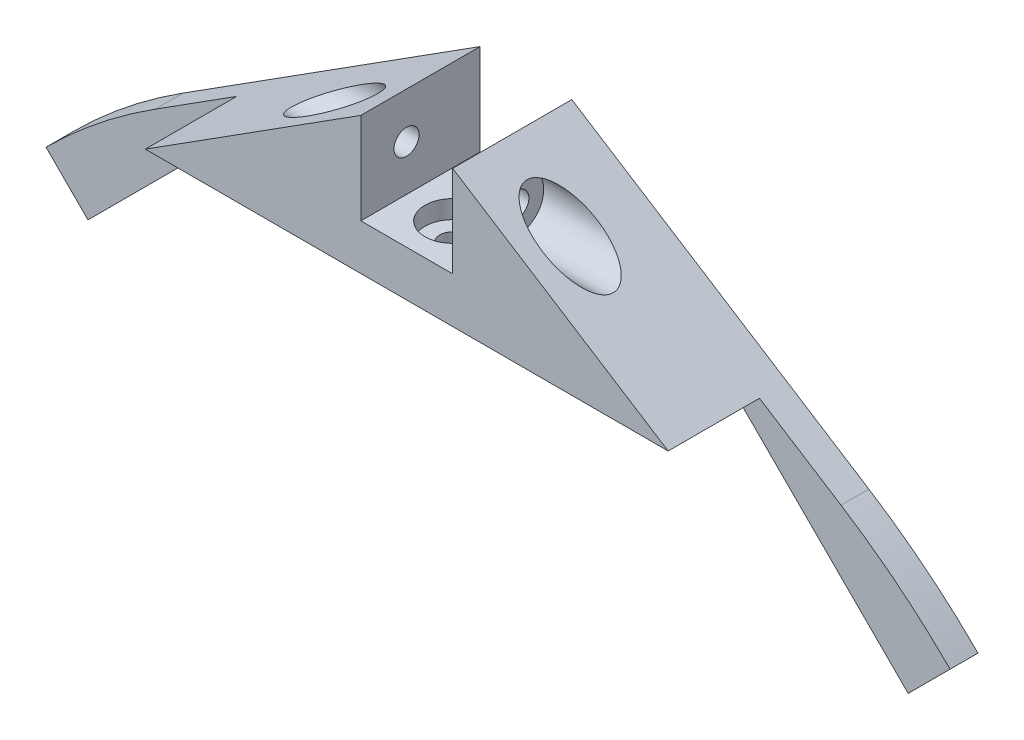
ISO-10303-21;
HEADER;
FILE_DESCRIPTION(('STEP AP214'),'2;1');
FILE_NAME('part.step','',(''),(''),'','','');
FILE_SCHEMA(('AUTOMOTIVE_DESIGN { 1 0 10303 214 1 1 1 1 }'));
ENDSEC;
DATA;
#1=APPLICATION_CONTEXT('core data for automotive mechanical design processes');
#2=APPLICATION_PROTOCOL_DEFINITION('international standard','automotive_design',2000,#1);
#3=PRODUCT_CONTEXT('',#1,'mechanical');
#4=PRODUCT('Part','Part','',(#3));
#5=PRODUCT_RELATED_PRODUCT_CATEGORY('part','',(#4));
#6=PRODUCT_DEFINITION_FORMATION('','',#4);
#7=PRODUCT_DEFINITION_CONTEXT('part definition',#1,'design');
#8=PRODUCT_DEFINITION('design','',#6,#7);
#9=PRODUCT_DEFINITION_SHAPE('','',#8);
#10=(LENGTH_UNIT() NAMED_UNIT(*) SI_UNIT(.MILLI.,.METRE.));
#11=(NAMED_UNIT(*) PLANE_ANGLE_UNIT() SI_UNIT($,.RADIAN.));
#12=(NAMED_UNIT(*) SI_UNIT($,.STERADIAN.) SOLID_ANGLE_UNIT());
#13=UNCERTAINTY_MEASURE_WITH_UNIT(LENGTH_MEASURE(1.E-05),#10,'distance_accuracy_value','');
#14=(GEOMETRIC_REPRESENTATION_CONTEXT(3) GLOBAL_UNCERTAINTY_ASSIGNED_CONTEXT((#13)) GLOBAL_UNIT_ASSIGNED_CONTEXT((#10,
#11,#12)) REPRESENTATION_CONTEXT('',''));
#15=CARTESIAN_POINT('',(0.,0.,0.));
#16=DIRECTION('',(0.,0.,1.));
#17=DIRECTION('',(1.,0.,0.));
#18=AXIS2_PLACEMENT_3D('',#15,#16,#17);
#19=CARTESIAN_POINT('',(-98.9949493661174,149.5,10.));
#20=DIRECTION('',(1.,0.,0.));
#21=DIRECTION('',(0.,0.,-1.));
#22=AXIS2_PLACEMENT_3D('',#19,#20,#21);
#23=CYLINDRICAL_SURFACE('',#22,2.75);
#24=CARTESIAN_POINT('',(10.0499999999994,149.5,10.));
#25=DIRECTION('',(1.,0.,0.));
#26=DIRECTION('',(0.,1.,0.));
#27=AXIS2_PLACEMENT_3D('',#24,#25,#26);
#28=CIRCLE('',#27,2.75);
#29=CARTESIAN_POINT('',(10.0499999999994,152.25,10.));
#30=VERTEX_POINT('',#29);
#31=EDGE_CURVE('E262',#30,#30,#28,.T.);
#32=ORIENTED_EDGE('',*,*,#31,.F.);
#33=EDGE_LOOP('',(#32));
#34=FACE_BOUND('',#33,.T.);
#35=CARTESIAN_POINT('',(14.,149.5,10.));
#36=DIRECTION('',(1.,0.,0.));
#37=DIRECTION('',(0.,0.,-1.));
#38=AXIS2_PLACEMENT_3D('',#35,#36,#37);
#39=CIRCLE('',#38,2.75);
#40=CARTESIAN_POINT('',(14.,149.5,7.25));
#41=VERTEX_POINT('',#40);
#42=EDGE_CURVE('E256',#41,#41,#39,.F.);
#43=ORIENTED_EDGE('',*,*,#42,.F.);
#44=EDGE_LOOP('',(#43));
#45=FACE_BOUND('',#44,.T.);
#46=ADVANCED_FACE('F36',(#34,#45),#23,.F.);
#47=CARTESIAN_POINT('',(3.34600629187397E-13,119.5,10.));
#48=DIRECTION('',(0.,1.,0.));
#49=DIRECTION('',(-1.,0.,0.));
#50=AXIS2_PLACEMENT_3D('',#47,#48,#49);
#51=CYLINDRICAL_SURFACE('',#50,2.75);
#52=CARTESIAN_POINT('',(3.62218117362153E-13,129.5,10.));
#53=DIRECTION('',(0.,-1.,0.));
#54=DIRECTION('',(0.,0.,-1.));
#55=AXIS2_PLACEMENT_3D('',#52,#53,#54);
#56=CIRCLE('',#55,2.75);
#57=CARTESIAN_POINT('',(3.62218117362153E-13,129.5,7.25));
#58=VERTEX_POINT('',#57);
#59=EDGE_CURVE('E161',#58,#58,#56,.T.);
#60=ORIENTED_EDGE('',*,*,#59,.T.);
#61=EDGE_LOOP('',(#60));
#62=FACE_BOUND('',#61,.T.);
#63=CARTESIAN_POINT('',(3.78788610267007E-13,135.5,10.));
#64=DIRECTION('',(0.,1.,0.));
#65=DIRECTION('',(-1.,0.,0.));
#66=AXIS2_PLACEMENT_3D('',#63,#64,#65);
#67=CIRCLE('',#66,2.75);
#68=CARTESIAN_POINT('',(-2.74999999999962,135.5,10.));
#69=VERTEX_POINT('',#68);
#70=EDGE_CURVE('E166',#69,#69,#67,.F.);
#71=ORIENTED_EDGE('',*,*,#70,.F.);
#72=EDGE_LOOP('',(#71));
#73=FACE_BOUND('',#72,.T.);
#74=ADVANCED_FACE('F302',(#62,#73),#51,.F.);
#75=CARTESIAN_POINT('',(1.23866037892397E-11,1.24063554245807E-11,0.));
#76=DIRECTION('',(0.,0.,1.));
#77=DIRECTION('',(1.,0.,0.));
#78=AXIS2_PLACEMENT_3D('',#75,#76,#77);
#79=PLANE('',#78);
#80=DIRECTION('',(-0.843942591214155,0.536433502621469,0.));
#81=VECTOR('',#80,1.);
#82=CARTESIAN_POINT('',(10.0499999999994,159.5,0.));
#83=LINE('',#82,#81);
#84=CARTESIAN_POINT('',(75.1006903669907,118.151962769992,0.));
#85=VERTEX_POINT('',#84);
#86=CARTESIAN_POINT('',(57.2474207664098,129.5,0.));
#87=VERTEX_POINT('',#86);
#88=EDGE_CURVE('E61',#85,#87,#83,.T.);
#89=ORIENTED_EDGE('',*,*,#88,.T.);
#90=DIRECTION('',(1.,0.,0.));
#91=VECTOR('',#90,1.);
#92=CARTESIAN_POINT('',(50.1051224213822,129.5,0.));
#93=LINE('',#92,#91);
#94=CARTESIAN_POINT('',(50.105122421383,129.5,0.));
#95=VERTEX_POINT('',#94);
#96=EDGE_CURVE('E160',#95,#87,#93,.T.);
#97=ORIENTED_EDGE('',*,*,#96,.F.);
#98=DIRECTION('',(0.707106781186547,-0.707106781186548,0.));
#99=VECTOR('',#98,1.);
#100=CARTESIAN_POINT('',(50.105122421383,129.5,0.));
#101=LINE('',#100,#99);
#102=CARTESIAN_POINT('',(89.8025612106913,89.8025612106917,0.));
#103=VERTEX_POINT('',#102);
#104=EDGE_CURVE('E213',#95,#103,#101,.T.);
#105=ORIENTED_EDGE('',*,*,#104,.T.);
#106=DIRECTION('',(0.707106781186548,0.707106781186548,0.));
#107=VECTOR('',#106,1.);
#108=CARTESIAN_POINT('',(89.8025612106913,89.8025612106917,0.));
#109=LINE('',#108,#107);
#110=CARTESIAN_POINT('',(98.9949493661289,98.9949493661292,0.));
#111=VERTEX_POINT('',#110);
#112=EDGE_CURVE('E208',#103,#111,#109,.T.);
#113=ORIENTED_EDGE('',*,*,#112,.T.);
#114=CARTESIAN_POINT('',(1.23866037892397E-11,1.24063554245807E-11,0.));
#115=DIRECTION('',(0.,0.,1.));
#116=DIRECTION('',(1.,0.,0.));
#117=AXIS2_PLACEMENT_3D('',#114,#115,#116);
#118=CIRCLE('',#117,140.);
#119=EDGE_CURVE('E233',#111,#85,#118,.T.);
#120=ORIENTED_EDGE('',*,*,#119,.T.);
#121=EDGE_LOOP('',(#89,#97,#105,#113,#120));
#122=FACE_BOUND('',#121,.T.);
#123=ADVANCED_FACE('F309',(#122),#79,.T.);
#124=DIRECTION('',(0.707106781186525,0.70710678118657,0.));
#125=VECTOR('',#124,1.);
#126=CARTESIAN_POINT('',(-89.8025612106907,89.8025612106898,0.));
#127=LINE('',#126,#125);
#128=CARTESIAN_POINT('',(-89.8025612106907,89.8025612106898,0.));
#129=VERTEX_POINT('',#128);
#130=CARTESIAN_POINT('',(-50.1051224213829,129.5,0.));
#131=VERTEX_POINT('',#130);
#132=EDGE_CURVE('E238',#129,#131,#127,.T.);
#133=ORIENTED_EDGE('',*,*,#132,.T.);
#134=DIRECTION('',(1.,0.,0.));
#135=VECTOR('',#134,1.);
#136=CARTESIAN_POINT('',(-50.1051224213829,129.5,0.));
#137=LINE('',#136,#135);
#138=CARTESIAN_POINT('',(-57.2474207664105,129.5,0.));
#139=VERTEX_POINT('',#138);
#140=EDGE_CURVE('E175',#139,#131,#137,.T.);
#141=ORIENTED_EDGE('',*,*,#140,.F.);
#142=DIRECTION('',(-0.843942591214158,-0.536433502621465,0.));
#143=VECTOR('',#142,1.);
#144=CARTESIAN_POINT('',(-10.05,159.5,0.));
#145=LINE('',#144,#143);
#146=CARTESIAN_POINT('',(-75.1006903669927,118.151962769995,0.));
#147=VERTEX_POINT('',#146);
#148=EDGE_CURVE('E184',#139,#147,#145,.T.);
#149=ORIENTED_EDGE('',*,*,#148,.T.);
#150=CARTESIAN_POINT('',(-98.9949493661174,98.994949366116,0.));
#151=VERTEX_POINT('',#150);
#152=EDGE_CURVE('E232',#147,#151,#118,.T.);
#153=ORIENTED_EDGE('',*,*,#152,.T.);
#154=DIRECTION('',(0.70710678118657,-0.707106781186525,0.));
#155=VECTOR('',#154,1.);
#156=CARTESIAN_POINT('',(-89.8025612106907,89.8025612106898,0.));
#157=LINE('',#156,#155);
#158=EDGE_CURVE('E235',#151,#129,#157,.T.);
#159=ORIENTED_EDGE('',*,*,#158,.T.);
#160=EDGE_LOOP('',(#133,#141,#149,#153,#159));
#161=FACE_BOUND('',#160,.T.);
#162=ADVANCED_FACE('F373',(#161),#79,.T.);
#163=CARTESIAN_POINT('',(1.23866037892397E-11,1.24063554245807E-11,-6.1));
#164=DIRECTION('',(0.,0.,1.));
#165=DIRECTION('',(1.,0.,0.));
#166=AXIS2_PLACEMENT_3D('',#163,#164,#165);
#167=CYLINDRICAL_SURFACE('',#166,140.);
#168=ORIENTED_EDGE('',*,*,#152,.F.);
#169=DIRECTION('',(0.,0.,1.));
#170=VECTOR('',#169,1.);
#171=CARTESIAN_POINT('',(-75.1006903669927,118.151962769995,-6.1));
#172=LINE('',#171,#170);
#173=CARTESIAN_POINT('',(-75.1006903669927,118.151962769995,-6.1));
#174=VERTEX_POINT('',#173);
#175=EDGE_CURVE('E148',#174,#147,#172,.T.);
#176=ORIENTED_EDGE('',*,*,#175,.F.);
#177=CARTESIAN_POINT('',(1.23866037892397E-11,1.24063554245807E-11,-6.1));
#178=DIRECTION('',(0.,0.,1.));
#179=DIRECTION('',(1.,0.,0.));
#180=AXIS2_PLACEMENT_3D('',#177,#178,#179);
#181=CIRCLE('',#180,140.);
#182=CARTESIAN_POINT('',(-98.9949493661174,98.994949366116,-6.1));
#183=VERTEX_POINT('',#182);
#184=EDGE_CURVE('E212',#174,#183,#181,.T.);
#185=ORIENTED_EDGE('',*,*,#184,.T.);
#186=DIRECTION('',(0.,0.,1.));
#187=VECTOR('',#186,1.);
#188=CARTESIAN_POINT('',(-98.9949493661174,98.994949366116,-6.1));
#189=LINE('',#188,#187);
#190=EDGE_CURVE('E249',#183,#151,#189,.T.);
#191=ORIENTED_EDGE('',*,*,#190,.T.);
#192=EDGE_LOOP('',(#168,#176,#185,#191));
#193=FACE_BOUND('',#192,.T.);
#194=ADVANCED_FACE('F369',(#193),#167,.T.);
#195=CARTESIAN_POINT('',(89.8025612106913,89.8025612106917,-6.1));
#196=DIRECTION('',(0.707106781186548,-0.707106781186548,0.));
#197=DIRECTION('',(0.707106781186548,0.707106781186548,0.));
#198=AXIS2_PLACEMENT_3D('',#195,#196,#197);
#199=PLANE('',#198);
#200=ORIENTED_EDGE('',*,*,#112,.F.);
#201=DIRECTION('',(0.,0.,1.));
#202=VECTOR('',#201,1.);
#203=CARTESIAN_POINT('',(89.8025612106913,89.8025612106917,-6.1));
#204=LINE('',#203,#202);
#205=CARTESIAN_POINT('',(89.8025612106913,89.8025612106917,-6.1));
#206=VERTEX_POINT('',#205);
#207=EDGE_CURVE('E11',#206,#103,#204,.T.);
#208=ORIENTED_EDGE('',*,*,#207,.F.);
#209=DIRECTION('',(0.707106781186548,0.707106781186548,0.));
#210=VECTOR('',#209,1.);
#211=CARTESIAN_POINT('',(89.8025612106913,89.8025612106917,-6.1));
#212=LINE('',#211,#210);
#213=CARTESIAN_POINT('',(98.9949493661289,98.9949493661292,-6.1));
#214=VERTEX_POINT('',#213);
#215=EDGE_CURVE('E209',#206,#214,#212,.T.);
#216=ORIENTED_EDGE('',*,*,#215,.T.);
#217=DIRECTION('',(0.,0.,1.));
#218=VECTOR('',#217,1.);
#219=CARTESIAN_POINT('',(98.9949493661289,98.9949493661292,-6.1));
#220=LINE('',#219,#218);
#221=EDGE_CURVE('E229',#214,#111,#220,.T.);
#222=ORIENTED_EDGE('',*,*,#221,.T.);
#223=EDGE_LOOP('',(#200,#208,#216,#222));
#224=FACE_BOUND('',#223,.T.);
#225=ADVANCED_FACE('F38',(#224),#199,.T.);
#226=CARTESIAN_POINT('',(50.105122421383,129.5,-6.1));
#227=DIRECTION('',(-0.707106781186548,-0.707106781186547,0.));
#228=DIRECTION('',(0.707106781186547,-0.707106781186548,0.));
#229=AXIS2_PLACEMENT_3D('',#226,#227,#228);
#230=PLANE('',#229);
#231=ORIENTED_EDGE('',*,*,#104,.F.);
#232=DIRECTION('',(0.,0.,1.));
#233=VECTOR('',#232,1.);
#234=CARTESIAN_POINT('',(50.105122421383,129.5,-6.1));
#235=LINE('',#234,#233);
#236=CARTESIAN_POINT('',(50.105122421383,129.5,-6.1));
#237=VERTEX_POINT('',#236);
#238=EDGE_CURVE('E45',#237,#95,#235,.T.);
#239=ORIENTED_EDGE('',*,*,#238,.F.);
#240=DIRECTION('',(0.707106781186547,-0.707106781186548,0.));
#241=VECTOR('',#240,1.);
#242=CARTESIAN_POINT('',(50.105122421383,129.5,-6.1));
#243=LINE('',#242,#241);
#244=EDGE_CURVE('E226',#237,#206,#243,.T.);
#245=ORIENTED_EDGE('',*,*,#244,.T.);
#246=ORIENTED_EDGE('',*,*,#207,.T.);
#247=EDGE_LOOP('',(#231,#239,#245,#246));
#248=FACE_BOUND('',#247,.T.);
#249=ADVANCED_FACE('F353',(#248),#230,.T.);
#250=CARTESIAN_POINT('',(50.105122421383,129.5,-6.1));
#251=DIRECTION('',(0.,-1.,0.));
#252=DIRECTION('',(0.,0.,-1.));
#253=AXIS2_PLACEMENT_3D('',#250,#251,#252);
#254=PLANE('',#253);
#255=ORIENTED_EDGE('',*,*,#59,.F.);
#256=EDGE_LOOP('',(#255));
#257=FACE_BOUND('',#256,.T.);
#258=DIRECTION('',(1.,0.,0.));
#259=VECTOR('',#258,1.);
#260=CARTESIAN_POINT('',(-50.1051224213829,129.5,20.));
#261=LINE('',#260,#259);
#262=CARTESIAN_POINT('',(-57.2474207664105,129.5,20.));
#263=VERTEX_POINT('',#262);
#264=CARTESIAN_POINT('',(57.2474207664098,129.5,20.));
#265=VERTEX_POINT('',#264);
#266=EDGE_CURVE('E198',#263,#265,#261,.T.);
#267=ORIENTED_EDGE('',*,*,#266,.F.);
#268=DIRECTION('',(0.,0.,-1.));
#269=VECTOR('',#268,1.);
#270=CARTESIAN_POINT('',(-57.2474207664105,129.5,20.));
#271=LINE('',#270,#269);
#272=EDGE_CURVE('E179',#263,#139,#271,.T.);
#273=ORIENTED_EDGE('',*,*,#272,.T.);
#274=ORIENTED_EDGE('',*,*,#140,.T.);
#275=DIRECTION('',(0.,0.,1.));
#276=VECTOR('',#275,1.);
#277=CARTESIAN_POINT('',(-50.1051224213829,129.5,-6.1));
#278=LINE('',#277,#276);
#279=CARTESIAN_POINT('',(-50.1051224213829,129.5,-6.1));
#280=VERTEX_POINT('',#279);
#281=EDGE_CURVE('E244',#280,#131,#278,.T.);
#282=ORIENTED_EDGE('',*,*,#281,.F.);
#283=DIRECTION('',(1.,0.,0.));
#284=VECTOR('',#283,1.);
#285=CARTESIAN_POINT('',(50.105122421383,129.5,-6.1));
#286=LINE('',#285,#284);
#287=EDGE_CURVE('E223',#280,#237,#286,.T.);
#288=ORIENTED_EDGE('',*,*,#287,.T.);
#289=ORIENTED_EDGE('',*,*,#238,.T.);
#290=ORIENTED_EDGE('',*,*,#96,.T.);
#291=DIRECTION('',(0.,0.,-1.));
#292=VECTOR('',#291,1.);
#293=CARTESIAN_POINT('',(57.2474207664098,129.5,20.));
#294=LINE('',#293,#292);
#295=EDGE_CURVE('E171',#265,#87,#294,.T.);
#296=ORIENTED_EDGE('',*,*,#295,.F.);
#297=EDGE_LOOP('',(#267,#273,#274,#282,#288,#289,#290,#296));
#298=FACE_BOUND('',#297,.T.);
#299=ADVANCED_FACE('F355',(#257,#298),#254,.T.);
#300=CARTESIAN_POINT('',(-89.8025612106907,89.8025612106898,-6.1));
#301=DIRECTION('',(0.70710678118657,-0.707106781186525,0.));
#302=DIRECTION('',(0.707106781186525,0.70710678118657,0.));
#303=AXIS2_PLACEMENT_3D('',#300,#301,#302);
#304=PLANE('',#303);
#305=ORIENTED_EDGE('',*,*,#132,.F.);
#306=DIRECTION('',(0.,0.,1.));
#307=VECTOR('',#306,1.);
#308=CARTESIAN_POINT('',(-89.8025612106907,89.8025612106898,-6.1));
#309=LINE('',#308,#307);
#310=CARTESIAN_POINT('',(-89.8025612106907,89.8025612106898,-6.1));
#311=VERTEX_POINT('',#310);
#312=EDGE_CURVE('E247',#311,#129,#309,.T.);
#313=ORIENTED_EDGE('',*,*,#312,.F.);
#314=DIRECTION('',(0.707106781186525,0.70710678118657,0.));
#315=VECTOR('',#314,1.);
#316=CARTESIAN_POINT('',(-89.8025612106907,89.8025612106898,-6.1));
#317=LINE('',#316,#315);
#318=EDGE_CURVE('E220',#311,#280,#317,.T.);
#319=ORIENTED_EDGE('',*,*,#318,.T.);
#320=ORIENTED_EDGE('',*,*,#281,.T.);
#321=EDGE_LOOP('',(#305,#313,#319,#320));
#322=FACE_BOUND('',#321,.T.);
#323=ADVANCED_FACE('F360',(#322),#304,.T.);
#324=CARTESIAN_POINT('',(-89.8025612106907,89.8025612106898,-6.1));
#325=DIRECTION('',(-0.707106781186525,-0.70710678118657,0.));
#326=DIRECTION('',(0.70710678118657,-0.707106781186525,0.));
#327=AXIS2_PLACEMENT_3D('',#324,#325,#326);
#328=PLANE('',#327);
#329=ORIENTED_EDGE('',*,*,#158,.F.);
#330=ORIENTED_EDGE('',*,*,#190,.F.);
#331=DIRECTION('',(0.70710678118657,-0.707106781186525,0.));
#332=VECTOR('',#331,1.);
#333=CARTESIAN_POINT('',(-89.8025612106907,89.8025612106898,-6.1));
#334=LINE('',#333,#332);
#335=EDGE_CURVE('E217',#183,#311,#334,.T.);
#336=ORIENTED_EDGE('',*,*,#335,.T.);
#337=ORIENTED_EDGE('',*,*,#312,.T.);
#338=EDGE_LOOP('',(#329,#330,#336,#337));
#339=FACE_BOUND('',#338,.T.);
#340=ADVANCED_FACE('F363',(#339),#328,.T.);
#341=DIRECTION('',(0.,0.,1.));
#342=VECTOR('',#341,1.);
#343=CARTESIAN_POINT('',(75.1006903669907,118.151962769992,-6.1));
#344=LINE('',#343,#342);
#345=CARTESIAN_POINT('',(75.1006903669907,118.151962769992,-6.1));
#346=VERTEX_POINT('',#345);
#347=EDGE_CURVE('E191',#346,#85,#344,.T.);
#348=ORIENTED_EDGE('',*,*,#347,.T.);
#349=ORIENTED_EDGE('',*,*,#119,.F.);
#350=ORIENTED_EDGE('',*,*,#221,.F.);
#351=EDGE_CURVE('E214',#214,#346,#181,.T.);
#352=ORIENTED_EDGE('',*,*,#351,.T.);
#353=EDGE_LOOP('',(#348,#349,#350,#352));
#354=FACE_BOUND('',#353,.T.);
#355=ADVANCED_FACE('F345',(#354),#167,.T.);
#356=CARTESIAN_POINT('',(1.23866037892397E-11,1.24063554245807E-11,-6.1));
#357=DIRECTION('',(0.,0.,1.));
#358=DIRECTION('',(1.,0.,0.));
#359=AXIS2_PLACEMENT_3D('',#356,#357,#358);
#360=PLANE('',#359);
#361=DIRECTION('',(1.,0.,0.));
#362=VECTOR('',#361,1.);
#363=CARTESIAN_POINT('',(10.0499999999993,139.5,-6.1));
#364=LINE('',#363,#362);
#365=CARTESIAN_POINT('',(-10.05,139.5,-6.1));
#366=VERTEX_POINT('',#365);
#367=CARTESIAN_POINT('',(10.0499999999993,139.5,-6.1));
#368=VERTEX_POINT('',#367);
#369=EDGE_CURVE('E155',#366,#368,#364,.T.);
#370=ORIENTED_EDGE('',*,*,#369,.T.);
#371=DIRECTION('',(0.,-1.,0.));
#372=VECTOR('',#371,1.);
#373=CARTESIAN_POINT('',(10.0499999999993,139.5,-6.1));
#374=LINE('',#373,#372);
#375=CARTESIAN_POINT('',(10.0499999999994,159.5,-6.1));
#376=VERTEX_POINT('',#375);
#377=EDGE_CURVE('E139',#376,#368,#374,.T.);
#378=ORIENTED_EDGE('',*,*,#377,.F.);
#379=DIRECTION('',(-0.843942591214155,0.536433502621469,0.));
#380=VECTOR('',#379,1.);
#381=CARTESIAN_POINT('',(10.0499999999994,159.5,-6.1));
#382=LINE('',#381,#380);
#383=EDGE_CURVE('E149',#346,#376,#382,.T.);
#384=ORIENTED_EDGE('',*,*,#383,.F.);
#385=ORIENTED_EDGE('',*,*,#351,.F.);
#386=ORIENTED_EDGE('',*,*,#215,.F.);
#387=ORIENTED_EDGE('',*,*,#244,.F.);
#388=ORIENTED_EDGE('',*,*,#287,.F.);
#389=ORIENTED_EDGE('',*,*,#318,.F.);
#390=ORIENTED_EDGE('',*,*,#335,.F.);
#391=ORIENTED_EDGE('',*,*,#184,.F.);
#392=DIRECTION('',(-0.843942591214158,-0.536433502621465,0.));
#393=VECTOR('',#392,1.);
#394=CARTESIAN_POINT('',(-10.05,159.5,-6.1));
#395=LINE('',#394,#393);
#396=CARTESIAN_POINT('',(-10.05,159.5,-6.1));
#397=VERTEX_POINT('',#396);
#398=EDGE_CURVE('E186',#397,#174,#395,.T.);
#399=ORIENTED_EDGE('',*,*,#398,.F.);
#400=DIRECTION('',(0.,1.,0.));
#401=VECTOR('',#400,1.);
#402=CARTESIAN_POINT('',(-10.05,139.5,-6.1));
#403=LINE('',#402,#401);
#404=EDGE_CURVE('E53',#366,#397,#403,.T.);
#405=ORIENTED_EDGE('',*,*,#404,.F.);
#406=EDGE_LOOP('',(#370,#378,#384,#385,#386,#387,#388,#389,#390,#391,#399,#405));
#407=FACE_BOUND('',#406,.T.);
#408=ADVANCED_FACE('F159',(#407),#360,.F.);
#409=CARTESIAN_POINT('',(-10.05,139.5,20.));
#410=DIRECTION('',(-1.,0.,0.));
#411=DIRECTION('',(0.,0.,1.));
#412=AXIS2_PLACEMENT_3D('',#409,#410,#411);
#413=PLANE('',#412);
#414=CARTESIAN_POINT('',(-10.05,149.5,10.));
#415=DIRECTION('',(-1.,0.,0.));
#416=DIRECTION('',(0.,0.,1.));
#417=AXIS2_PLACEMENT_3D('',#414,#415,#416);
#418=CIRCLE('',#417,2.75);
#419=CARTESIAN_POINT('',(-10.05,149.5,12.75));
#420=VERTEX_POINT('',#419);
#421=EDGE_CURVE('E278',#420,#420,#418,.T.);
#422=ORIENTED_EDGE('',*,*,#421,.T.);
#423=EDGE_LOOP('',(#422));
#424=FACE_BOUND('',#423,.T.);
#425=DIRECTION('',(0.,0.,-1.));
#426=VECTOR('',#425,1.);
#427=CARTESIAN_POINT('',(-10.05,139.5,20.));
#428=LINE('',#427,#426);
#429=CARTESIAN_POINT('',(-10.05,139.5,20.));
#430=VERTEX_POINT('',#429);
#431=EDGE_CURVE('E157',#430,#366,#428,.T.);
#432=ORIENTED_EDGE('',*,*,#431,.T.);
#433=ORIENTED_EDGE('',*,*,#404,.T.);
#434=DIRECTION('',(0.,0.,-1.));
#435=VECTOR('',#434,1.);
#436=CARTESIAN_POINT('',(-10.05,159.5,20.));
#437=LINE('',#436,#435);
#438=CARTESIAN_POINT('',(-10.05,159.5,20.));
#439=VERTEX_POINT('',#438);
#440=EDGE_CURVE('E205',#439,#397,#437,.T.);
#441=ORIENTED_EDGE('',*,*,#440,.F.);
#442=DIRECTION('',(0.,1.,0.));
#443=VECTOR('',#442,1.);
#444=CARTESIAN_POINT('',(-10.05,139.5,20.));
#445=LINE('',#444,#443);
#446=EDGE_CURVE('E194',#430,#439,#445,.T.);
#447=ORIENTED_EDGE('',*,*,#446,.F.);
#448=EDGE_LOOP('',(#432,#433,#441,#447));
#449=FACE_BOUND('',#448,.T.);
#450=ADVANCED_FACE('F298',(#424,#449),#413,.F.);
#451=CARTESIAN_POINT('',(10.0499999999993,139.5,20.));
#452=DIRECTION('',(1.,0.,0.));
#453=DIRECTION('',(0.,1.,0.));
#454=AXIS2_PLACEMENT_3D('',#451,#452,#453);
#455=PLANE('',#454);
#456=ORIENTED_EDGE('',*,*,#31,.T.);
#457=EDGE_LOOP('',(#456));
#458=FACE_BOUND('',#457,.T.);
#459=ORIENTED_EDGE('',*,*,#377,.T.);
#460=DIRECTION('',(0.,0.,-1.));
#461=VECTOR('',#460,1.);
#462=CARTESIAN_POINT('',(10.0499999999993,139.5,20.));
#463=LINE('',#462,#461);
#464=CARTESIAN_POINT('',(10.0499999999993,139.5,20.));
#465=VERTEX_POINT('',#464);
#466=EDGE_CURVE('E142',#465,#368,#463,.T.);
#467=ORIENTED_EDGE('',*,*,#466,.F.);
#468=DIRECTION('',(0.,-1.,0.));
#469=VECTOR('',#468,1.);
#470=CARTESIAN_POINT('',(10.0499999999993,139.5,20.));
#471=LINE('',#470,#469);
#472=CARTESIAN_POINT('',(10.0499999999994,159.5,20.));
#473=VERTEX_POINT('',#472);
#474=EDGE_CURVE('E200',#473,#465,#471,.T.);
#475=ORIENTED_EDGE('',*,*,#474,.F.);
#476=DIRECTION('',(0.,0.,-1.));
#477=VECTOR('',#476,1.);
#478=CARTESIAN_POINT('',(10.0499999999994,159.5,20.));
#479=LINE('',#478,#477);
#480=EDGE_CURVE('E145',#473,#376,#479,.T.);
#481=ORIENTED_EDGE('',*,*,#480,.T.);
#482=EDGE_LOOP('',(#459,#467,#475,#481));
#483=FACE_BOUND('',#482,.T.);
#484=ADVANCED_FACE('F141',(#458,#483),#455,.F.);
#485=CARTESIAN_POINT('',(10.0499999999993,139.5,20.));
#486=DIRECTION('',(0.,-1.,0.));
#487=DIRECTION('',(1.,0.,0.));
#488=AXIS2_PLACEMENT_3D('',#485,#486,#487);
#489=PLANE('',#488);
#490=CARTESIAN_POINT('',(3.89835605536909E-13,139.5,10.));
#491=DIRECTION('',(0.,1.,0.));
#492=DIRECTION('',(-1.,0.,0.));
#493=AXIS2_PLACEMENT_3D('',#490,#491,#492);
#494=CIRCLE('',#493,6.);
#495=CARTESIAN_POINT('',(-5.99999999999961,139.5,10.));
#496=VERTEX_POINT('',#495);
#497=EDGE_CURVE('E281',#496,#496,#494,.T.);
#498=ORIENTED_EDGE('',*,*,#497,.F.);
#499=EDGE_LOOP('',(#498));
#500=FACE_BOUND('',#499,.T.);
#501=ORIENTED_EDGE('',*,*,#466,.T.);
#502=ORIENTED_EDGE('',*,*,#369,.F.);
#503=ORIENTED_EDGE('',*,*,#431,.F.);
#504=DIRECTION('',(-1.,0.,0.));
#505=VECTOR('',#504,1.);
#506=CARTESIAN_POINT('',(10.0499999999993,139.5,20.));
#507=LINE('',#506,#505);
#508=EDGE_CURVE('E156',#465,#430,#507,.T.);
#509=ORIENTED_EDGE('',*,*,#508,.F.);
#510=EDGE_LOOP('',(#501,#502,#503,#509));
#511=FACE_BOUND('',#510,.T.);
#512=ADVANCED_FACE('F153',(#500,#511),#489,.F.);
#513=CARTESIAN_POINT('',(0.,0.,20.));
#514=DIRECTION('',(0.,0.,-1.));
#515=DIRECTION('',(-1.,0.,0.));
#516=AXIS2_PLACEMENT_3D('',#513,#514,#515);
#517=PLANE('',#516);
#518=ORIENTED_EDGE('',*,*,#446,.T.);
#519=DIRECTION('',(-0.843942591214157,-0.536433502621465,0.));
#520=VECTOR('',#519,1.);
#521=CARTESIAN_POINT('',(-10.05,159.5,20.));
#522=LINE('',#521,#520);
#523=EDGE_CURVE('E176',#439,#263,#522,.T.);
#524=ORIENTED_EDGE('',*,*,#523,.T.);
#525=ORIENTED_EDGE('',*,*,#266,.T.);
#526=DIRECTION('',(-0.843942591214155,0.53643350262147,0.));
#527=VECTOR('',#526,1.);
#528=CARTESIAN_POINT('',(10.0499999999994,159.5,20.));
#529=LINE('',#528,#527);
#530=EDGE_CURVE('E163',#265,#473,#529,.T.);
#531=ORIENTED_EDGE('',*,*,#530,.T.);
#532=ORIENTED_EDGE('',*,*,#474,.T.);
#533=ORIENTED_EDGE('',*,*,#508,.T.);
#534=EDGE_LOOP('',(#518,#524,#525,#531,#532,#533));
#535=FACE_BOUND('',#534,.T.);
#536=ADVANCED_FACE('F289',(#535),#517,.F.);
#537=CARTESIAN_POINT('',(-10.05,159.5,-6.1));
#538=DIRECTION('',(-0.536433502621465,0.843942591214158,0.));
#539=DIRECTION('',(-0.843942591214158,-0.536433502621465,0.));
#540=AXIS2_PLACEMENT_3D('',#537,#538,#539);
#541=PLANE('',#540);
#542=CARTESIAN_POINT('',(-25.7824735888036,149.5,10.));
#543=DIRECTION('',(-0.536433502621465,0.843942591214158,0.));
#544=DIRECTION('',(0.843942591214158,0.536433502621465,0.));
#545=AXIS2_PLACEMENT_3D('',#542,#543,#544);
#546=ELLIPSE('',#545,11.1849837317747,6.);
#547=CARTESIAN_POINT('',(-16.3429894355214,155.5,10.));
#548=VERTEX_POINT('',#547);
#549=EDGE_CURVE('E40',#548,#548,#546,.T.);
#550=ORIENTED_EDGE('',*,*,#549,.F.);
#551=EDGE_LOOP('',(#550));
#552=FACE_BOUND('',#551,.T.);
#553=ORIENTED_EDGE('',*,*,#148,.F.);
#554=ORIENTED_EDGE('',*,*,#272,.F.);
#555=ORIENTED_EDGE('',*,*,#523,.F.);
#556=ORIENTED_EDGE('',*,*,#440,.T.);
#557=ORIENTED_EDGE('',*,*,#398,.T.);
#558=ORIENTED_EDGE('',*,*,#175,.T.);
#559=EDGE_LOOP('',(#553,#554,#555,#556,#557,#558));
#560=FACE_BOUND('',#559,.T.);
#561=ADVANCED_FACE('F295',(#552,#560),#541,.T.);
#562=CARTESIAN_POINT('',(10.0499999999994,159.5,-6.1));
#563=DIRECTION('',(0.536433502621469,0.843942591214155,0.));
#564=DIRECTION('',(-0.843942591214155,0.536433502621469,0.));
#565=AXIS2_PLACEMENT_3D('',#562,#563,#564);
#566=PLANE('',#565);
#567=CARTESIAN_POINT('',(25.7824735888027,149.5,10.));
#568=DIRECTION('',(0.536433502621469,0.843942591214155,0.));
#569=DIRECTION('',(-0.843942591214155,0.536433502621469,0.));
#570=AXIS2_PLACEMENT_3D('',#567,#568,#569);
#571=ELLIPSE('',#570,11.1849837317746,6.);
#572=CARTESIAN_POINT('',(16.3429894355207,155.5,10.));
#573=VERTEX_POINT('',#572);
#574=EDGE_CURVE('E259',#573,#573,#571,.F.);
#575=ORIENTED_EDGE('',*,*,#574,.T.);
#576=EDGE_LOOP('',(#575));
#577=FACE_BOUND('',#576,.T.);
#578=ORIENTED_EDGE('',*,*,#88,.F.);
#579=ORIENTED_EDGE('',*,*,#347,.F.);
#580=ORIENTED_EDGE('',*,*,#383,.T.);
#581=ORIENTED_EDGE('',*,*,#480,.F.);
#582=ORIENTED_EDGE('',*,*,#530,.F.);
#583=ORIENTED_EDGE('',*,*,#295,.T.);
#584=EDGE_LOOP('',(#578,#579,#580,#581,#582,#583));
#585=FACE_BOUND('',#584,.T.);
#586=ADVANCED_FACE('F341',(#577,#585),#566,.T.);
#587=CARTESIAN_POINT('',(3.78788610267007E-13,135.5,10.));
#588=DIRECTION('',(0.,1.,0.));
#589=DIRECTION('',(-1.,0.,0.));
#590=AXIS2_PLACEMENT_3D('',#587,#588,#589);
#591=PLANE('',#590);
#592=CARTESIAN_POINT('',(3.78788610267007E-13,135.5,10.));
#593=DIRECTION('',(0.,1.,0.));
#594=DIRECTION('',(-1.,0.,0.));
#595=AXIS2_PLACEMENT_3D('',#592,#593,#594);
#596=CIRCLE('',#595,6.);
#597=CARTESIAN_POINT('',(-5.99999999999962,135.5,10.));
#598=VERTEX_POINT('',#597);
#599=EDGE_CURVE('E255',#598,#598,#596,.T.);
#600=ORIENTED_EDGE('',*,*,#599,.T.);
#601=EDGE_LOOP('',(#600));
#602=FACE_BOUND('',#601,.T.);
#603=ORIENTED_EDGE('',*,*,#70,.T.);
#604=EDGE_LOOP('',(#603));
#605=FACE_BOUND('',#604,.T.);
#606=ADVANCED_FACE('F325',(#602,#605),#591,.T.);
#607=CARTESIAN_POINT('',(3.78788610267007E-13,135.5,10.));
#608=DIRECTION('',(0.,1.,0.));
#609=DIRECTION('',(-1.,0.,0.));
#610=AXIS2_PLACEMENT_3D('',#607,#608,#609);
#611=CYLINDRICAL_SURFACE('',#610,6.);
#612=ORIENTED_EDGE('',*,*,#599,.F.);
#613=EDGE_LOOP('',(#612));
#614=FACE_BOUND('',#613,.T.);
#615=ORIENTED_EDGE('',*,*,#497,.T.);
#616=EDGE_LOOP('',(#615));
#617=FACE_BOUND('',#616,.T.);
#618=ADVANCED_FACE('F286',(#614,#617),#611,.F.);
#619=CARTESIAN_POINT('',(-14.,149.5,10.));
#620=DIRECTION('',(1.,0.,0.));
#621=DIRECTION('',(0.,0.,-1.));
#622=AXIS2_PLACEMENT_3D('',#619,#620,#621);
#623=CIRCLE('',#622,2.75);
#624=CARTESIAN_POINT('',(-14.,149.5,7.25));
#625=VERTEX_POINT('',#624);
#626=EDGE_CURVE('E263',#625,#625,#623,.F.);
#627=ORIENTED_EDGE('',*,*,#626,.T.);
#628=EDGE_LOOP('',(#627));
#629=FACE_BOUND('',#628,.T.);
#630=ORIENTED_EDGE('',*,*,#421,.F.);
#631=EDGE_LOOP('',(#630));
#632=FACE_BOUND('',#631,.T.);
#633=ADVANCED_FACE('F305',(#629,#632),#23,.F.);
#634=CARTESIAN_POINT('',(14.,149.5,10.));
#635=DIRECTION('',(1.,0.,0.));
#636=DIRECTION('',(0.,0.,-1.));
#637=AXIS2_PLACEMENT_3D('',#634,#635,#636);
#638=PLANE('',#637);
#639=CARTESIAN_POINT('',(14.,149.5,10.));
#640=DIRECTION('',(1.,0.,0.));
#641=DIRECTION('',(0.,0.,-1.));
#642=AXIS2_PLACEMENT_3D('',#639,#640,#641);
#643=CIRCLE('',#642,6.);
#644=CARTESIAN_POINT('',(14.,149.5,4.));
#645=VERTEX_POINT('',#644);
#646=EDGE_CURVE('E260',#645,#645,#643,.T.);
#647=ORIENTED_EDGE('',*,*,#646,.T.);
#648=EDGE_LOOP('',(#647));
#649=FACE_BOUND('',#648,.T.);
#650=ORIENTED_EDGE('',*,*,#42,.T.);
#651=EDGE_LOOP('',(#650));
#652=FACE_BOUND('',#651,.T.);
#653=ADVANCED_FACE('F317',(#649,#652),#638,.T.);
#654=CARTESIAN_POINT('',(98.9949493661289,149.5,10.));
#655=DIRECTION('',(-1.,0.,0.));
#656=DIRECTION('',(0.,0.,1.));
#657=AXIS2_PLACEMENT_3D('',#654,#655,#656);
#658=CYLINDRICAL_SURFACE('',#657,6.);
#659=ORIENTED_EDGE('',*,*,#574,.F.);
#660=EDGE_LOOP('',(#659));
#661=FACE_BOUND('',#660,.T.);
#662=ORIENTED_EDGE('',*,*,#646,.F.);
#663=EDGE_LOOP('',(#662));
#664=FACE_BOUND('',#663,.T.);
#665=ADVANCED_FACE('F322',(#661,#664),#658,.F.);
#666=CARTESIAN_POINT('',(-14.,149.5,10.));
#667=DIRECTION('',(1.,0.,0.));
#668=DIRECTION('',(0.,0.,-1.));
#669=AXIS2_PLACEMENT_3D('',#666,#667,#668);
#670=PLANE('',#669);
#671=CARTESIAN_POINT('',(-14.,149.5,10.));
#672=DIRECTION('',(1.,0.,0.));
#673=DIRECTION('',(0.,0.,-1.));
#674=AXIS2_PLACEMENT_3D('',#671,#672,#673);
#675=CIRCLE('',#674,6.);
#676=CARTESIAN_POINT('',(-14.,149.5,4.));
#677=VERTEX_POINT('',#676);
#678=EDGE_CURVE('E265',#677,#677,#675,.T.);
#679=ORIENTED_EDGE('',*,*,#678,.F.);
#680=EDGE_LOOP('',(#679));
#681=FACE_BOUND('',#680,.T.);
#682=ORIENTED_EDGE('',*,*,#626,.F.);
#683=EDGE_LOOP('',(#682));
#684=FACE_BOUND('',#683,.T.);
#685=ADVANCED_FACE('F543',(#681,#684),#670,.F.);
#686=CARTESIAN_POINT('',(-98.9949493661174,149.5,10.));
#687=DIRECTION('',(1.,0.,0.));
#688=DIRECTION('',(0.,0.,-1.));
#689=AXIS2_PLACEMENT_3D('',#686,#687,#688);
#690=CYLINDRICAL_SURFACE('',#689,6.);
#691=ORIENTED_EDGE('',*,*,#549,.T.);
#692=EDGE_LOOP('',(#691));
#693=FACE_BOUND('',#692,.T.);
#694=ORIENTED_EDGE('',*,*,#678,.T.);
#695=EDGE_LOOP('',(#694));
#696=FACE_BOUND('',#695,.T.);
#697=ADVANCED_FACE('F551',(#693,#696),#690,.F.);
#698=CLOSED_SHELL('',(#46,#74,#123,#162,#194,#225,#249,#299,#323,#340,#355,#408,#450,#484,#512,
#536,#561,#586,#606,#618,#633,#653,#665,#685,#697));
#699=MANIFOLD_SOLID_BREP('B2',#698);
#700=ADVANCED_BREP_SHAPE_REPRESENTATION('',(#18,#699),#14);
#701=SHAPE_DEFINITION_REPRESENTATION(#9,#700);
ENDSEC;
END-ISO-10303-21;
